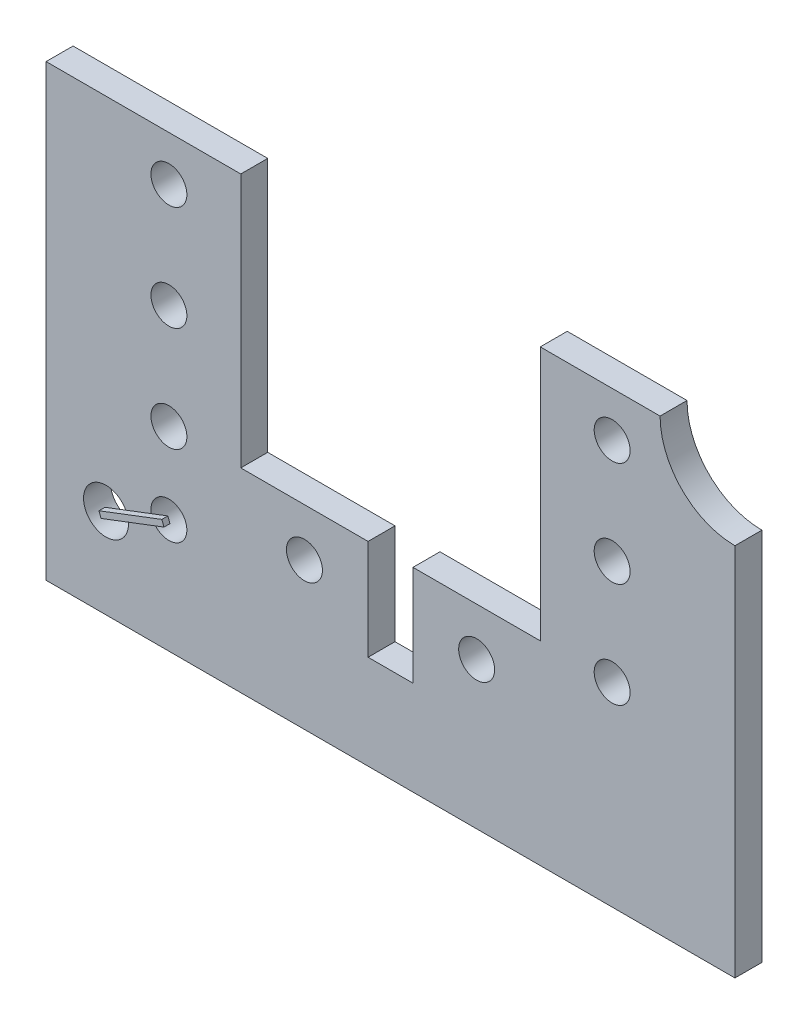
ISO-10303-21;
HEADER;
FILE_DESCRIPTION(('STEP AP214'),'2;1');
FILE_NAME('part.step','',(''),(''),'','','');
FILE_SCHEMA(('AUTOMOTIVE_DESIGN { 1 0 10303 214 1 1 1 1 }'));
ENDSEC;
DATA;
#1=APPLICATION_CONTEXT('core data for automotive mechanical design processes');
#2=APPLICATION_PROTOCOL_DEFINITION('international standard','automotive_design',2000,#1);
#3=PRODUCT_CONTEXT('',#1,'mechanical');
#4=PRODUCT('Part','Part','',(#3));
#5=PRODUCT_RELATED_PRODUCT_CATEGORY('part','',(#4));
#6=PRODUCT_DEFINITION_FORMATION('','',#4);
#7=PRODUCT_DEFINITION_CONTEXT('part definition',#1,'design');
#8=PRODUCT_DEFINITION('design','',#6,#7);
#9=PRODUCT_DEFINITION_SHAPE('','',#8);
#10=(LENGTH_UNIT() NAMED_UNIT(*) SI_UNIT(.MILLI.,.METRE.));
#11=(NAMED_UNIT(*) PLANE_ANGLE_UNIT() SI_UNIT($,.RADIAN.));
#12=(NAMED_UNIT(*) SI_UNIT($,.STERADIAN.) SOLID_ANGLE_UNIT());
#13=UNCERTAINTY_MEASURE_WITH_UNIT(LENGTH_MEASURE(1.E-05),#10,'distance_accuracy_value','');
#14=(GEOMETRIC_REPRESENTATION_CONTEXT(3) GLOBAL_UNCERTAINTY_ASSIGNED_CONTEXT((#13)) GLOBAL_UNIT_ASSIGNED_CONTEXT((#10,
#11,#12)) REPRESENTATION_CONTEXT('',''));
#15=CARTESIAN_POINT('',(0.,0.,0.));
#16=DIRECTION('',(0.,0.,1.));
#17=DIRECTION('',(1.,0.,0.));
#18=AXIS2_PLACEMENT_3D('',#15,#16,#17);
#19=CARTESIAN_POINT('',(11.5,-3.5,-0.45));
#20=DIRECTION('',(0.,0.,1.));
#21=DIRECTION('',(1.,0.,0.));
#22=AXIS2_PLACEMENT_3D('',#19,#20,#21);
#23=PLANE('',#22);
#24=DIRECTION('',(-1.,0.,0.));
#25=VECTOR('',#24,1.);
#26=CARTESIAN_POINT('',(-5.,-12.,-0.45));
#27=LINE('',#26,#25);
#28=CARTESIAN_POINT('',(-0.75,-12.,-0.45));
#29=VERTEX_POINT('',#28);
#30=CARTESIAN_POINT('',(-5.,-12.,-0.45));
#31=VERTEX_POINT('',#30);
#32=EDGE_CURVE('E373',#29,#31,#27,.T.);
#33=ORIENTED_EDGE('',*,*,#32,.F.);
#34=DIRECTION('',(0.,-1.,0.));
#35=VECTOR('',#34,1.);
#36=CARTESIAN_POINT('',(-0.750000000000001,-3.5,-0.45));
#37=LINE('',#36,#35);
#38=CARTESIAN_POINT('',(-0.75,-15.35,-0.45));
#39=VERTEX_POINT('',#38);
#40=EDGE_CURVE('E415',#29,#39,#37,.T.);
#41=ORIENTED_EDGE('',*,*,#40,.T.);
#42=DIRECTION('',(1.,0.,0.));
#43=VECTOR('',#42,1.);
#44=CARTESIAN_POINT('',(11.5,-15.35,-0.45));
#45=LINE('',#44,#43);
#46=CARTESIAN_POINT('',(0.750000000000001,-15.35,-0.45));
#47=VERTEX_POINT('',#46);
#48=EDGE_CURVE('E409',#39,#47,#45,.T.);
#49=ORIENTED_EDGE('',*,*,#48,.T.);
#50=DIRECTION('',(0.,1.,0.));
#51=VECTOR('',#50,1.);
#52=CARTESIAN_POINT('',(0.750000000000001,-3.5,-0.45));
#53=LINE('',#52,#51);
#54=CARTESIAN_POINT('',(0.75,-12.,-0.45));
#55=VERTEX_POINT('',#54);
#56=EDGE_CURVE('E412',#47,#55,#53,.T.);
#57=ORIENTED_EDGE('',*,*,#56,.T.);
#58=CARTESIAN_POINT('',(5.,-12.,-0.45));
#59=VERTEX_POINT('',#58);
#60=EDGE_CURVE('E374',#59,#55,#27,.T.);
#61=ORIENTED_EDGE('',*,*,#60,.F.);
#62=DIRECTION('',(0.,-1.,0.));
#63=VECTOR('',#62,1.);
#64=CARTESIAN_POINT('',(5.,-3.5,-0.45));
#65=LINE('',#64,#63);
#66=CARTESIAN_POINT('',(5.,-3.5,-0.45));
#67=VERTEX_POINT('',#66);
#68=EDGE_CURVE('E371',#67,#59,#65,.T.);
#69=ORIENTED_EDGE('',*,*,#68,.F.);
#70=DIRECTION('',(-1.,0.,0.));
#71=VECTOR('',#70,1.);
#72=CARTESIAN_POINT('',(5.,-3.5,-0.45));
#73=LINE('',#72,#71);
#74=CARTESIAN_POINT('',(9.,-3.5,-0.45));
#75=VERTEX_POINT('',#74);
#76=EDGE_CURVE('E369',#75,#67,#73,.T.);
#77=ORIENTED_EDGE('',*,*,#76,.F.);
#78=CARTESIAN_POINT('',(11.5,-3.5,-0.45));
#79=DIRECTION('',(0.,0.,-1.));
#80=DIRECTION('',(1.,0.,0.));
#81=AXIS2_PLACEMENT_3D('',#78,#79,#80);
#82=CIRCLE('',#81,2.5);
#83=CARTESIAN_POINT('',(11.5,-6.,-0.45));
#84=VERTEX_POINT('',#83);
#85=EDGE_CURVE('E367',#84,#75,#82,.T.);
#86=ORIENTED_EDGE('',*,*,#85,.F.);
#87=DIRECTION('',(0.,1.,0.));
#88=VECTOR('',#87,1.);
#89=CARTESIAN_POINT('',(11.5,-18.5,-0.45));
#90=LINE('',#89,#88);
#91=CARTESIAN_POINT('',(11.5,-18.5,-0.45));
#92=VERTEX_POINT('',#91);
#93=EDGE_CURVE('E365',#92,#84,#90,.T.);
#94=ORIENTED_EDGE('',*,*,#93,.F.);
#95=DIRECTION('',(1.,0.,0.));
#96=VECTOR('',#95,1.);
#97=CARTESIAN_POINT('',(-11.5,-18.5,-0.45));
#98=LINE('',#97,#96);
#99=CARTESIAN_POINT('',(-11.5,-18.5,-0.45));
#100=VERTEX_POINT('',#99);
#101=EDGE_CURVE('E340',#100,#92,#98,.T.);
#102=ORIENTED_EDGE('',*,*,#101,.F.);
#103=DIRECTION('',(0.,-1.,0.));
#104=VECTOR('',#103,1.);
#105=CARTESIAN_POINT('',(-11.5,-3.5,-0.45));
#106=LINE('',#105,#104);
#107=CARTESIAN_POINT('',(-11.5,-3.5,-0.45));
#108=VERTEX_POINT('',#107);
#109=EDGE_CURVE('E345',#108,#100,#106,.T.);
#110=ORIENTED_EDGE('',*,*,#109,.F.);
#111=DIRECTION('',(-1.,0.,0.));
#112=VECTOR('',#111,1.);
#113=CARTESIAN_POINT('',(-9.,-3.5,-0.45));
#114=LINE('',#113,#112);
#115=CARTESIAN_POINT('',(-5.,-3.5,-0.45));
#116=VERTEX_POINT('',#115);
#117=EDGE_CURVE('E380',#116,#108,#114,.T.);
#118=ORIENTED_EDGE('',*,*,#117,.F.);
#119=DIRECTION('',(0.,1.,0.));
#120=VECTOR('',#119,1.);
#121=CARTESIAN_POINT('',(-5.,-3.5,-0.45));
#122=LINE('',#121,#120);
#123=EDGE_CURVE('E377',#31,#116,#122,.T.);
#124=ORIENTED_EDGE('',*,*,#123,.F.);
#125=EDGE_LOOP('',(#33,#41,#49,#57,#61,#69,#77,#86,#94,#102,#110,#118,#124));
#126=FACE_BOUND('',#125,.T.);
#127=CARTESIAN_POINT('',(7.4,-8.5,-0.45));
#128=DIRECTION('',(0.,0.,1.));
#129=DIRECTION('',(1.,0.,0.));
#130=AXIS2_PLACEMENT_3D('',#127,#128,#129);
#131=CIRCLE('',#130,0.6);
#132=CARTESIAN_POINT('',(8.,-8.5,-0.45));
#133=VERTEX_POINT('',#132);
#134=EDGE_CURVE('E274',#133,#133,#131,.T.);
#135=ORIENTED_EDGE('',*,*,#134,.T.);
#136=EDGE_LOOP('',(#135));
#137=FACE_BOUND('',#136,.T.);
#138=CARTESIAN_POINT('',(-7.4,-5.,-0.45));
#139=DIRECTION('',(0.,0.,1.));
#140=DIRECTION('',(1.,0.,0.));
#141=AXIS2_PLACEMENT_3D('',#138,#139,#140);
#142=CIRCLE('',#141,0.6);
#143=CARTESIAN_POINT('',(-6.8,-5.,-0.45));
#144=VERTEX_POINT('',#143);
#145=EDGE_CURVE('E286',#144,#144,#142,.T.);
#146=ORIENTED_EDGE('',*,*,#145,.T.);
#147=EDGE_LOOP('',(#146));
#148=FACE_BOUND('',#147,.T.);
#149=CARTESIAN_POINT('',(7.4,-12.,-0.45));
#150=DIRECTION('',(0.,0.,1.));
#151=DIRECTION('',(1.,0.,0.));
#152=AXIS2_PLACEMENT_3D('',#149,#150,#151);
#153=CIRCLE('',#152,0.6);
#154=CARTESIAN_POINT('',(7.99999999999999,-12.,-0.45));
#155=VERTEX_POINT('',#154);
#156=EDGE_CURVE('E290',#155,#155,#153,.T.);
#157=ORIENTED_EDGE('',*,*,#156,.T.);
#158=EDGE_LOOP('',(#157));
#159=FACE_BOUND('',#158,.T.);
#160=CARTESIAN_POINT('',(2.875,-13.6,-0.45));
#161=DIRECTION('',(0.,0.,1.));
#162=DIRECTION('',(1.,0.,0.));
#163=AXIS2_PLACEMENT_3D('',#160,#161,#162);
#164=CIRCLE('',#163,0.6);
#165=CARTESIAN_POINT('',(3.475,-13.6,-0.45));
#166=VERTEX_POINT('',#165);
#167=EDGE_CURVE('E294',#166,#166,#164,.T.);
#168=ORIENTED_EDGE('',*,*,#167,.T.);
#169=EDGE_LOOP('',(#168));
#170=FACE_BOUND('',#169,.T.);
#171=CARTESIAN_POINT('',(-7.4,-8.5,-0.45));
#172=DIRECTION('',(0.,0.,1.));
#173=DIRECTION('',(1.,0.,0.));
#174=AXIS2_PLACEMENT_3D('',#171,#172,#173);
#175=CIRCLE('',#174,0.6);
#176=CARTESIAN_POINT('',(-6.8,-8.5,-0.45));
#177=VERTEX_POINT('',#176);
#178=EDGE_CURVE('E306',#177,#177,#175,.T.);
#179=ORIENTED_EDGE('',*,*,#178,.T.);
#180=EDGE_LOOP('',(#179));
#181=FACE_BOUND('',#180,.T.);
#182=CARTESIAN_POINT('',(-7.4,-12.,-0.45));
#183=DIRECTION('',(0.,0.,1.));
#184=DIRECTION('',(1.,0.,0.));
#185=AXIS2_PLACEMENT_3D('',#182,#183,#184);
#186=CIRCLE('',#185,0.6);
#187=CARTESIAN_POINT('',(-6.8,-12.,-0.45));
#188=VERTEX_POINT('',#187);
#189=EDGE_CURVE('E311',#188,#188,#186,.T.);
#190=ORIENTED_EDGE('',*,*,#189,.T.);
#191=EDGE_LOOP('',(#190));
#192=FACE_BOUND('',#191,.T.);
#193=CARTESIAN_POINT('',(7.4,-5.,-0.45));
#194=DIRECTION('',(0.,0.,1.));
#195=DIRECTION('',(1.,0.,0.));
#196=AXIS2_PLACEMENT_3D('',#193,#194,#195);
#197=CIRCLE('',#196,0.6);
#198=CARTESIAN_POINT('',(8.,-5.,-0.45));
#199=VERTEX_POINT('',#198);
#200=EDGE_CURVE('E315',#199,#199,#197,.T.);
#201=ORIENTED_EDGE('',*,*,#200,.T.);
#202=EDGE_LOOP('',(#201));
#203=FACE_BOUND('',#202,.T.);
#204=CARTESIAN_POINT('',(-9.5,-15.5,-0.45));
#205=DIRECTION('',(0.,0.,1.));
#206=DIRECTION('',(1.,0.,0.));
#207=AXIS2_PLACEMENT_3D('',#204,#205,#206);
#208=CIRCLE('',#207,0.75);
#209=CARTESIAN_POINT('',(-8.75,-15.5,-0.45));
#210=VERTEX_POINT('',#209);
#211=EDGE_CURVE('E40',#210,#210,#208,.T.);
#212=ORIENTED_EDGE('',*,*,#211,.T.);
#213=EDGE_LOOP('',(#212));
#214=FACE_BOUND('',#213,.T.);
#215=DIRECTION('',(-0.971700915312232,-0.236214587147725,0.));
#216=VECTOR('',#215,1.);
#217=CARTESIAN_POINT('',(-2.84783532247801,-13.7117456052609,-0.45));
#218=LINE('',#217,#216);
#219=CARTESIAN_POINT('',(-3.42004671740088,-13.8508467178388,-0.45));
#220=VERTEX_POINT('',#219);
#221=CARTESIAN_POINT('',(-6.80062392755513,-14.672644492683,-0.45));
#222=VERTEX_POINT('',#221);
#223=EDGE_CURVE('E11',#220,#222,#218,.T.);
#224=ORIENTED_EDGE('',*,*,#223,.F.);
#225=CARTESIAN_POINT('',(-2.875,-13.6,-0.45));
#226=DIRECTION('',(0.,0.,1.));
#227=DIRECTION('',(1.,0.,0.));
#228=AXIS2_PLACEMENT_3D('',#225,#226,#227);
#229=CIRCLE('',#228,0.6);
#230=CARTESIAN_POINT('',(-3.47437607244486,-13.627355507317,-0.45));
#231=VERTEX_POINT('',#230);
#232=EDGE_CURVE('E301',#220,#231,#229,.T.);
#233=ORIENTED_EDGE('',*,*,#232,.T.);
#234=DIRECTION('',(-0.971700915312232,-0.236214587147725,0.));
#235=VECTOR('',#234,1.);
#236=CARTESIAN_POINT('',(-2.90216467752199,-13.4882543947391,-0.45));
#237=LINE('',#236,#235);
#238=CARTESIAN_POINT('',(-6.85495328259911,-14.4491532821612,-0.45));
#239=VERTEX_POINT('',#238);
#240=EDGE_CURVE('E45',#231,#239,#237,.T.);
#241=ORIENTED_EDGE('',*,*,#240,.T.);
#242=CARTESIAN_POINT('',(-7.4,-14.7,-0.45));
#243=DIRECTION('',(0.,0.,1.));
#244=DIRECTION('',(1.,0.,0.));
#245=AXIS2_PLACEMENT_3D('',#242,#243,#244);
#246=CIRCLE('',#245,0.6);
#247=EDGE_CURVE('E298',#239,#222,#246,.T.);
#248=ORIENTED_EDGE('',*,*,#247,.T.);
#249=EDGE_LOOP('',(#224,#233,#241,#248));
#250=FACE_BOUND('',#249,.T.);
#251=ADVANCED_FACE('F36',(#126,#137,#148,#159,#170,#181,#192,#203,#214,#250),#23,.F.);
#252=CARTESIAN_POINT('',(11.5,-3.5,0.45));
#253=DIRECTION('',(0.,0.,1.));
#254=DIRECTION('',(1.,0.,0.));
#255=AXIS2_PLACEMENT_3D('',#252,#253,#254);
#256=PLANE('',#255);
#257=CARTESIAN_POINT('',(7.4,-5.,0.45));
#258=DIRECTION('',(0.,0.,1.));
#259=DIRECTION('',(1.,0.,0.));
#260=AXIS2_PLACEMENT_3D('',#257,#258,#259);
#261=CIRCLE('',#260,0.6);
#262=CARTESIAN_POINT('',(8.,-5.,0.45));
#263=VERTEX_POINT('',#262);
#264=EDGE_CURVE('E316',#263,#263,#261,.T.);
#265=ORIENTED_EDGE('',*,*,#264,.F.);
#266=EDGE_LOOP('',(#265));
#267=FACE_BOUND('',#266,.T.);
#268=CARTESIAN_POINT('',(-7.4,-12.,0.45));
#269=DIRECTION('',(0.,0.,1.));
#270=DIRECTION('',(1.,0.,0.));
#271=AXIS2_PLACEMENT_3D('',#268,#269,#270);
#272=CIRCLE('',#271,0.6);
#273=CARTESIAN_POINT('',(-6.8,-12.,0.45));
#274=VERTEX_POINT('',#273);
#275=EDGE_CURVE('E312',#274,#274,#272,.T.);
#276=ORIENTED_EDGE('',*,*,#275,.F.);
#277=EDGE_LOOP('',(#276));
#278=FACE_BOUND('',#277,.T.);
#279=CARTESIAN_POINT('',(-7.4,-8.5,0.45));
#280=DIRECTION('',(0.,0.,1.));
#281=DIRECTION('',(1.,0.,0.));
#282=AXIS2_PLACEMENT_3D('',#279,#280,#281);
#283=CIRCLE('',#282,0.6);
#284=CARTESIAN_POINT('',(-6.8,-8.5,0.45));
#285=VERTEX_POINT('',#284);
#286=EDGE_CURVE('E308',#285,#285,#283,.T.);
#287=ORIENTED_EDGE('',*,*,#286,.F.);
#288=EDGE_LOOP('',(#287));
#289=FACE_BOUND('',#288,.T.);
#290=CARTESIAN_POINT('',(-2.875,-13.6,0.45));
#291=DIRECTION('',(0.,0.,1.));
#292=DIRECTION('',(1.,0.,0.));
#293=AXIS2_PLACEMENT_3D('',#290,#291,#292);
#294=CIRCLE('',#293,0.6);
#295=CARTESIAN_POINT('',(-2.275,-13.6,0.45));
#296=VERTEX_POINT('',#295);
#297=EDGE_CURVE('E303',#296,#296,#294,.T.);
#298=ORIENTED_EDGE('',*,*,#297,.F.);
#299=EDGE_LOOP('',(#298));
#300=FACE_BOUND('',#299,.T.);
#301=CARTESIAN_POINT('',(2.875,-13.6,0.45));
#302=DIRECTION('',(0.,0.,1.));
#303=DIRECTION('',(1.,0.,0.));
#304=AXIS2_PLACEMENT_3D('',#301,#302,#303);
#305=CIRCLE('',#304,0.6);
#306=CARTESIAN_POINT('',(3.475,-13.6,0.45));
#307=VERTEX_POINT('',#306);
#308=EDGE_CURVE('E295',#307,#307,#305,.T.);
#309=ORIENTED_EDGE('',*,*,#308,.F.);
#310=EDGE_LOOP('',(#309));
#311=FACE_BOUND('',#310,.T.);
#312=CARTESIAN_POINT('',(7.4,-12.,0.45));
#313=DIRECTION('',(0.,0.,1.));
#314=DIRECTION('',(1.,0.,0.));
#315=AXIS2_PLACEMENT_3D('',#312,#313,#314);
#316=CIRCLE('',#315,0.6);
#317=CARTESIAN_POINT('',(7.99999999999999,-12.,0.45));
#318=VERTEX_POINT('',#317);
#319=EDGE_CURVE('E291',#318,#318,#316,.T.);
#320=ORIENTED_EDGE('',*,*,#319,.F.);
#321=EDGE_LOOP('',(#320));
#322=FACE_BOUND('',#321,.T.);
#323=CARTESIAN_POINT('',(-7.4,-5.,0.45));
#324=DIRECTION('',(0.,0.,1.));
#325=DIRECTION('',(1.,0.,0.));
#326=AXIS2_PLACEMENT_3D('',#323,#324,#325);
#327=CIRCLE('',#326,0.6);
#328=CARTESIAN_POINT('',(-6.8,-5.,0.45));
#329=VERTEX_POINT('',#328);
#330=EDGE_CURVE('E287',#329,#329,#327,.T.);
#331=ORIENTED_EDGE('',*,*,#330,.F.);
#332=EDGE_LOOP('',(#331));
#333=FACE_BOUND('',#332,.T.);
#334=CARTESIAN_POINT('',(7.4,-8.5,0.45));
#335=DIRECTION('',(0.,0.,1.));
#336=DIRECTION('',(1.,0.,0.));
#337=AXIS2_PLACEMENT_3D('',#334,#335,#336);
#338=CIRCLE('',#337,0.6);
#339=CARTESIAN_POINT('',(8.,-8.5,0.45));
#340=VERTEX_POINT('',#339);
#341=EDGE_CURVE('E283',#340,#340,#338,.T.);
#342=ORIENTED_EDGE('',*,*,#341,.F.);
#343=EDGE_LOOP('',(#342));
#344=FACE_BOUND('',#343,.T.);
#345=DIRECTION('',(0.,-1.,0.));
#346=VECTOR('',#345,1.);
#347=CARTESIAN_POINT('',(-0.750000000000001,-3.5,0.45));
#348=LINE('',#347,#346);
#349=CARTESIAN_POINT('',(-0.75,-12.,0.45));
#350=VERTEX_POINT('',#349);
#351=CARTESIAN_POINT('',(-0.75,-15.35,0.45));
#352=VERTEX_POINT('',#351);
#353=EDGE_CURVE('E338',#350,#352,#348,.T.);
#354=ORIENTED_EDGE('',*,*,#353,.F.);
#355=DIRECTION('',(-1.,0.,0.));
#356=VECTOR('',#355,1.);
#357=CARTESIAN_POINT('',(-5.,-12.,0.45));
#358=LINE('',#357,#356);
#359=CARTESIAN_POINT('',(-5.,-12.,0.45));
#360=VERTEX_POINT('',#359);
#361=EDGE_CURVE('E355',#350,#360,#358,.T.);
#362=ORIENTED_EDGE('',*,*,#361,.T.);
#363=DIRECTION('',(0.,1.,0.));
#364=VECTOR('',#363,1.);
#365=CARTESIAN_POINT('',(-5.,-3.5,0.45));
#366=LINE('',#365,#364);
#367=CARTESIAN_POINT('',(-5.,-3.5,0.45));
#368=VERTEX_POINT('',#367);
#369=EDGE_CURVE('E359',#360,#368,#366,.T.);
#370=ORIENTED_EDGE('',*,*,#369,.T.);
#371=DIRECTION('',(-1.,0.,0.));
#372=VECTOR('',#371,1.);
#373=CARTESIAN_POINT('',(-5.,-3.5,0.45));
#374=LINE('',#373,#372);
#375=CARTESIAN_POINT('',(-11.5,-3.5,0.45));
#376=VERTEX_POINT('',#375);
#377=EDGE_CURVE('E361',#368,#376,#374,.T.);
#378=ORIENTED_EDGE('',*,*,#377,.T.);
#379=DIRECTION('',(0.,-1.,0.));
#380=VECTOR('',#379,1.);
#381=CARTESIAN_POINT('',(-11.5,-18.5,0.45));
#382=LINE('',#381,#380);
#383=CARTESIAN_POINT('',(-11.5,-18.5,0.45));
#384=VERTEX_POINT('',#383);
#385=EDGE_CURVE('E341',#376,#384,#382,.T.);
#386=ORIENTED_EDGE('',*,*,#385,.T.);
#387=DIRECTION('',(1.,0.,0.));
#388=VECTOR('',#387,1.);
#389=CARTESIAN_POINT('',(-11.5,-18.5,0.45));
#390=LINE('',#389,#388);
#391=CARTESIAN_POINT('',(11.5,-18.5,0.45));
#392=VERTEX_POINT('',#391);
#393=EDGE_CURVE('E344',#384,#392,#390,.T.);
#394=ORIENTED_EDGE('',*,*,#393,.T.);
#395=DIRECTION('',(0.,1.,0.));
#396=VECTOR('',#395,1.);
#397=CARTESIAN_POINT('',(11.5,-18.5,0.45));
#398=LINE('',#397,#396);
#399=CARTESIAN_POINT('',(11.5,-6.,0.45));
#400=VERTEX_POINT('',#399);
#401=EDGE_CURVE('E347',#392,#400,#398,.T.);
#402=ORIENTED_EDGE('',*,*,#401,.T.);
#403=CARTESIAN_POINT('',(11.5,-3.5,0.45));
#404=DIRECTION('',(0.,0.,-1.));
#405=DIRECTION('',(1.,0.,0.));
#406=AXIS2_PLACEMENT_3D('',#403,#404,#405);
#407=CIRCLE('',#406,2.5);
#408=CARTESIAN_POINT('',(9.,-3.5,0.45));
#409=VERTEX_POINT('',#408);
#410=EDGE_CURVE('E349',#400,#409,#407,.T.);
#411=ORIENTED_EDGE('',*,*,#410,.T.);
#412=DIRECTION('',(-1.,0.,0.));
#413=VECTOR('',#412,1.);
#414=CARTESIAN_POINT('',(5.,-3.5,0.45));
#415=LINE('',#414,#413);
#416=CARTESIAN_POINT('',(5.,-3.5,0.45));
#417=VERTEX_POINT('',#416);
#418=EDGE_CURVE('E351',#409,#417,#415,.T.);
#419=ORIENTED_EDGE('',*,*,#418,.T.);
#420=DIRECTION('',(0.,-1.,0.));
#421=VECTOR('',#420,1.);
#422=CARTESIAN_POINT('',(5.,-3.5,0.45));
#423=LINE('',#422,#421);
#424=CARTESIAN_POINT('',(5.,-12.,0.45));
#425=VERTEX_POINT('',#424);
#426=EDGE_CURVE('E353',#417,#425,#423,.T.);
#427=ORIENTED_EDGE('',*,*,#426,.T.);
#428=CARTESIAN_POINT('',(0.75,-12.,0.45));
#429=VERTEX_POINT('',#428);
#430=EDGE_CURVE('E356',#425,#429,#358,.T.);
#431=ORIENTED_EDGE('',*,*,#430,.T.);
#432=DIRECTION('',(0.,1.,0.));
#433=VECTOR('',#432,1.);
#434=CARTESIAN_POINT('',(0.750000000000001,-3.5,0.45));
#435=LINE('',#434,#433);
#436=CARTESIAN_POINT('',(0.75,-15.35,0.45));
#437=VERTEX_POINT('',#436);
#438=EDGE_CURVE('E336',#437,#429,#435,.T.);
#439=ORIENTED_EDGE('',*,*,#438,.F.);
#440=DIRECTION('',(1.,0.,0.));
#441=VECTOR('',#440,1.);
#442=CARTESIAN_POINT('',(11.5,-15.35,0.45));
#443=LINE('',#442,#441);
#444=EDGE_CURVE('E326',#352,#437,#443,.T.);
#445=ORIENTED_EDGE('',*,*,#444,.F.);
#446=EDGE_LOOP('',(#354,#362,#370,#378,#386,#394,#402,#411,#419,#427,#431,#439,#445));
#447=FACE_BOUND('',#446,.T.);
#448=CARTESIAN_POINT('',(-9.5,-15.5,0.45));
#449=DIRECTION('',(0.,0.,1.));
#450=DIRECTION('',(1.,0.,0.));
#451=AXIS2_PLACEMENT_3D('',#448,#449,#450);
#452=CIRCLE('',#451,0.75);
#453=CARTESIAN_POINT('',(-8.8409915872102,-15.1419386758218,0.45));
#454=VERTEX_POINT('',#453);
#455=CARTESIAN_POINT('',(-8.7697925216918,-15.3288362228076,0.45));
#456=VERTEX_POINT('',#455);
#457=EDGE_CURVE('E323',#454,#456,#452,.T.);
#458=ORIENTED_EDGE('',*,*,#457,.F.);
#459=DIRECTION('',(0.934487734928968,0.355995327591989,0.));
#460=VECTOR('',#459,1.);
#461=CARTESIAN_POINT('',(-9.5355995327592,-15.4065512265071,0.45));
#462=LINE('',#461,#460);
#463=CARTESIAN_POINT('',(-7.98844993237598,-14.8171609025516,0.45));
#464=VERTEX_POINT('',#463);
#465=EDGE_CURVE('E63',#454,#464,#462,.T.);
#466=ORIENTED_EDGE('',*,*,#465,.T.);
#467=CARTESIAN_POINT('',(-7.4,-14.7,0.45));
#468=DIRECTION('',(0.,0.,1.));
#469=DIRECTION('',(1.,0.,0.));
#470=AXIS2_PLACEMENT_3D('',#467,#468,#469);
#471=CIRCLE('',#470,0.6);
#472=CARTESIAN_POINT('',(-7.91725086685758,-15.0040584495374,0.45));
#473=VERTEX_POINT('',#472);
#474=EDGE_CURVE('E302',#473,#464,#471,.T.);
#475=ORIENTED_EDGE('',*,*,#474,.F.);
#476=DIRECTION('',(0.934487734928968,0.355995327591989,0.));
#477=VECTOR('',#476,1.);
#478=CARTESIAN_POINT('',(-9.4644004672408,-15.5934487734929,0.45));
#479=LINE('',#478,#477);
#480=EDGE_CURVE('E270',#456,#473,#479,.T.);
#481=ORIENTED_EDGE('',*,*,#480,.F.);
#482=EDGE_LOOP('',(#458,#466,#475,#481));
#483=FACE_BOUND('',#482,.T.);
#484=ADVANCED_FACE('F455',(#267,#278,#289,#300,#311,#322,#333,#344,#447,#483),#256,.T.);
#485=CARTESIAN_POINT('',(-5.,-12.,0.45));
#486=DIRECTION('',(0.,-1.,0.));
#487=DIRECTION('',(0.,0.,-1.));
#488=AXIS2_PLACEMENT_3D('',#485,#486,#487);
#489=PLANE('',#488);
#490=ORIENTED_EDGE('',*,*,#361,.F.);
#491=DIRECTION('',(0.,0.,1.));
#492=VECTOR('',#491,1.);
#493=CARTESIAN_POINT('',(-0.75,-12.,-5.));
#494=LINE('',#493,#492);
#495=EDGE_CURVE('E324',#29,#350,#494,.T.);
#496=ORIENTED_EDGE('',*,*,#495,.F.);
#497=ORIENTED_EDGE('',*,*,#32,.T.);
#498=DIRECTION('',(0.,0.,-1.));
#499=VECTOR('',#498,1.);
#500=CARTESIAN_POINT('',(-5.,-12.,0.45));
#501=LINE('',#500,#499);
#502=EDGE_CURVE('E388',#360,#31,#501,.T.);
#503=ORIENTED_EDGE('',*,*,#502,.F.);
#504=EDGE_LOOP('',(#490,#496,#497,#503));
#505=FACE_BOUND('',#504,.T.);
#506=ADVANCED_FACE('F461',(#505),#489,.F.);
#507=CARTESIAN_POINT('',(-11.5,-18.5,0.45));
#508=DIRECTION('',(0.,1.,0.));
#509=DIRECTION('',(0.,0.,1.));
#510=AXIS2_PLACEMENT_3D('',#507,#508,#509);
#511=PLANE('',#510);
#512=ORIENTED_EDGE('',*,*,#101,.T.);
#513=DIRECTION('',(0.,0.,-1.));
#514=VECTOR('',#513,1.);
#515=CARTESIAN_POINT('',(11.5,-18.5,0.45));
#516=LINE('',#515,#514);
#517=EDGE_CURVE('E403',#392,#92,#516,.T.);
#518=ORIENTED_EDGE('',*,*,#517,.F.);
#519=ORIENTED_EDGE('',*,*,#393,.F.);
#520=DIRECTION('',(0.,0.,-1.));
#521=VECTOR('',#520,1.);
#522=CARTESIAN_POINT('',(-11.5,-18.5,0.45));
#523=LINE('',#522,#521);
#524=EDGE_CURVE('E406',#384,#100,#523,.T.);
#525=ORIENTED_EDGE('',*,*,#524,.T.);
#526=EDGE_LOOP('',(#512,#518,#519,#525));
#527=FACE_BOUND('',#526,.T.);
#528=ADVANCED_FACE('F38',(#527),#511,.F.);
#529=CARTESIAN_POINT('',(11.5,-18.5,0.45));
#530=DIRECTION('',(-1.,0.,0.));
#531=DIRECTION('',(0.,0.,1.));
#532=AXIS2_PLACEMENT_3D('',#529,#530,#531);
#533=PLANE('',#532);
#534=ORIENTED_EDGE('',*,*,#93,.T.);
#535=DIRECTION('',(0.,0.,-1.));
#536=VECTOR('',#535,1.);
#537=CARTESIAN_POINT('',(11.5,-6.,0.45));
#538=LINE('',#537,#536);
#539=EDGE_CURVE('E400',#400,#84,#538,.T.);
#540=ORIENTED_EDGE('',*,*,#539,.F.);
#541=ORIENTED_EDGE('',*,*,#401,.F.);
#542=ORIENTED_EDGE('',*,*,#517,.T.);
#543=EDGE_LOOP('',(#534,#540,#541,#542));
#544=FACE_BOUND('',#543,.T.);
#545=ADVANCED_FACE('F495',(#544),#533,.F.);
#546=CARTESIAN_POINT('',(11.5,-3.5,0.45));
#547=DIRECTION('',(0.,0.,-1.));
#548=DIRECTION('',(-1.,0.,0.));
#549=AXIS2_PLACEMENT_3D('',#546,#547,#548);
#550=CYLINDRICAL_SURFACE('',#549,2.5);
#551=ORIENTED_EDGE('',*,*,#85,.T.);
#552=DIRECTION('',(0.,0.,-1.));
#553=VECTOR('',#552,1.);
#554=CARTESIAN_POINT('',(9.,-3.5,0.45));
#555=LINE('',#554,#553);
#556=EDGE_CURVE('E397',#409,#75,#555,.T.);
#557=ORIENTED_EDGE('',*,*,#556,.F.);
#558=ORIENTED_EDGE('',*,*,#410,.F.);
#559=ORIENTED_EDGE('',*,*,#539,.T.);
#560=EDGE_LOOP('',(#551,#557,#558,#559));
#561=FACE_BOUND('',#560,.T.);
#562=ADVANCED_FACE('F492',(#561),#550,.F.);
#563=CARTESIAN_POINT('',(5.,-3.5,0.45));
#564=DIRECTION('',(0.,-1.,0.));
#565=DIRECTION('',(0.,0.,-1.));
#566=AXIS2_PLACEMENT_3D('',#563,#564,#565);
#567=PLANE('',#566);
#568=ORIENTED_EDGE('',*,*,#76,.T.);
#569=DIRECTION('',(0.,0.,-1.));
#570=VECTOR('',#569,1.);
#571=CARTESIAN_POINT('',(5.,-3.5,0.45));
#572=LINE('',#571,#570);
#573=EDGE_CURVE('E394',#417,#67,#572,.T.);
#574=ORIENTED_EDGE('',*,*,#573,.F.);
#575=ORIENTED_EDGE('',*,*,#418,.F.);
#576=ORIENTED_EDGE('',*,*,#556,.T.);
#577=EDGE_LOOP('',(#568,#574,#575,#576));
#578=FACE_BOUND('',#577,.T.);
#579=ADVANCED_FACE('F488',(#578),#567,.F.);
#580=CARTESIAN_POINT('',(5.,-3.5,0.45));
#581=DIRECTION('',(1.,0.,0.));
#582=DIRECTION('',(0.,1.,0.));
#583=AXIS2_PLACEMENT_3D('',#580,#581,#582);
#584=PLANE('',#583);
#585=ORIENTED_EDGE('',*,*,#68,.T.);
#586=DIRECTION('',(0.,0.,-1.));
#587=VECTOR('',#586,1.);
#588=CARTESIAN_POINT('',(5.,-12.,0.45));
#589=LINE('',#588,#587);
#590=EDGE_CURVE('E391',#425,#59,#589,.T.);
#591=ORIENTED_EDGE('',*,*,#590,.F.);
#592=ORIENTED_EDGE('',*,*,#426,.F.);
#593=ORIENTED_EDGE('',*,*,#573,.T.);
#594=EDGE_LOOP('',(#585,#591,#592,#593));
#595=FACE_BOUND('',#594,.T.);
#596=ADVANCED_FACE('F484',(#595),#584,.F.);
#597=ORIENTED_EDGE('',*,*,#60,.T.);
#598=DIRECTION('',(0.,0.,1.));
#599=VECTOR('',#598,1.);
#600=CARTESIAN_POINT('',(0.75,-12.,-5.));
#601=LINE('',#600,#599);
#602=EDGE_CURVE('E327',#55,#429,#601,.T.);
#603=ORIENTED_EDGE('',*,*,#602,.T.);
#604=ORIENTED_EDGE('',*,*,#430,.F.);
#605=ORIENTED_EDGE('',*,*,#590,.T.);
#606=EDGE_LOOP('',(#597,#603,#604,#605));
#607=FACE_BOUND('',#606,.T.);
#608=ADVANCED_FACE('F480',(#607),#489,.F.);
#609=CARTESIAN_POINT('',(-5.,-3.5,0.45));
#610=DIRECTION('',(-1.,0.,0.));
#611=DIRECTION('',(0.,-1.,0.));
#612=AXIS2_PLACEMENT_3D('',#609,#610,#611);
#613=PLANE('',#612);
#614=ORIENTED_EDGE('',*,*,#123,.T.);
#615=DIRECTION('',(0.,0.,-1.));
#616=VECTOR('',#615,1.);
#617=CARTESIAN_POINT('',(-5.,-3.5,0.45));
#618=LINE('',#617,#616);
#619=EDGE_CURVE('E385',#368,#116,#618,.T.);
#620=ORIENTED_EDGE('',*,*,#619,.F.);
#621=ORIENTED_EDGE('',*,*,#369,.F.);
#622=ORIENTED_EDGE('',*,*,#502,.T.);
#623=EDGE_LOOP('',(#614,#620,#621,#622));
#624=FACE_BOUND('',#623,.T.);
#625=ADVANCED_FACE('F476',(#624),#613,.F.);
#626=CARTESIAN_POINT('',(-9.,-3.5,0.45));
#627=DIRECTION('',(0.,-1.,0.));
#628=DIRECTION('',(0.,0.,-1.));
#629=AXIS2_PLACEMENT_3D('',#626,#627,#628);
#630=PLANE('',#629);
#631=ORIENTED_EDGE('',*,*,#117,.T.);
#632=DIRECTION('',(0.,0.,-1.));
#633=VECTOR('',#632,1.);
#634=CARTESIAN_POINT('',(-11.5,-3.5,0.45));
#635=LINE('',#634,#633);
#636=EDGE_CURVE('E363',#376,#108,#635,.T.);
#637=ORIENTED_EDGE('',*,*,#636,.F.);
#638=ORIENTED_EDGE('',*,*,#377,.F.);
#639=ORIENTED_EDGE('',*,*,#619,.T.);
#640=EDGE_LOOP('',(#631,#637,#638,#639));
#641=FACE_BOUND('',#640,.T.);
#642=ADVANCED_FACE('F472',(#641),#630,.F.);
#643=CARTESIAN_POINT('',(-11.5,-3.5,0.45));
#644=DIRECTION('',(1.,0.,0.));
#645=DIRECTION('',(0.,0.,-1.));
#646=AXIS2_PLACEMENT_3D('',#643,#644,#645);
#647=PLANE('',#646);
#648=ORIENTED_EDGE('',*,*,#109,.T.);
#649=ORIENTED_EDGE('',*,*,#524,.F.);
#650=ORIENTED_EDGE('',*,*,#385,.F.);
#651=ORIENTED_EDGE('',*,*,#636,.T.);
#652=EDGE_LOOP('',(#648,#649,#650,#651));
#653=FACE_BOUND('',#652,.T.);
#654=ADVANCED_FACE('F468',(#653),#647,.F.);
#655=CARTESIAN_POINT('',(-0.75,-15.25,-5.));
#656=DIRECTION('',(-1.,0.,0.));
#657=DIRECTION('',(0.,-1.,0.));
#658=AXIS2_PLACEMENT_3D('',#655,#656,#657);
#659=PLANE('',#658);
#660=ORIENTED_EDGE('',*,*,#353,.T.);
#661=DIRECTION('',(0.,0.,1.));
#662=VECTOR('',#661,1.);
#663=CARTESIAN_POINT('',(-0.75,-15.35,-5.));
#664=LINE('',#663,#662);
#665=EDGE_CURVE('E322',#39,#352,#664,.T.);
#666=ORIENTED_EDGE('',*,*,#665,.F.);
#667=ORIENTED_EDGE('',*,*,#40,.F.);
#668=ORIENTED_EDGE('',*,*,#495,.T.);
#669=EDGE_LOOP('',(#660,#666,#667,#668));
#670=FACE_BOUND('',#669,.T.);
#671=ADVANCED_FACE('F471',(#670),#659,.F.);
#672=CARTESIAN_POINT('',(0.75,-15.25,-5.));
#673=DIRECTION('',(1.,0.,0.));
#674=DIRECTION('',(0.,1.,0.));
#675=AXIS2_PLACEMENT_3D('',#672,#673,#674);
#676=PLANE('',#675);
#677=ORIENTED_EDGE('',*,*,#438,.T.);
#678=ORIENTED_EDGE('',*,*,#602,.F.);
#679=ORIENTED_EDGE('',*,*,#56,.F.);
#680=DIRECTION('',(0.,0.,1.));
#681=VECTOR('',#680,1.);
#682=CARTESIAN_POINT('',(0.75,-15.35,-5.));
#683=LINE('',#682,#681);
#684=EDGE_CURVE('E330',#47,#437,#683,.T.);
#685=ORIENTED_EDGE('',*,*,#684,.T.);
#686=EDGE_LOOP('',(#677,#678,#679,#685));
#687=FACE_BOUND('',#686,.T.);
#688=ADVANCED_FACE('F541',(#687),#676,.F.);
#689=CARTESIAN_POINT('',(-0.75,-15.35,-5.));
#690=DIRECTION('',(0.,-1.,0.));
#691=DIRECTION('',(0.,0.,-1.));
#692=AXIS2_PLACEMENT_3D('',#689,#690,#691);
#693=PLANE('',#692);
#694=ORIENTED_EDGE('',*,*,#444,.T.);
#695=ORIENTED_EDGE('',*,*,#684,.F.);
#696=ORIENTED_EDGE('',*,*,#48,.F.);
#697=ORIENTED_EDGE('',*,*,#665,.T.);
#698=EDGE_LOOP('',(#694,#695,#696,#697));
#699=FACE_BOUND('',#698,.T.);
#700=ADVANCED_FACE('F538',(#699),#693,.F.);
#701=CARTESIAN_POINT('',(7.4,-8.5,-5.));
#702=DIRECTION('',(0.,0.,1.));
#703=DIRECTION('',(1.,0.,0.));
#704=AXIS2_PLACEMENT_3D('',#701,#702,#703);
#705=CYLINDRICAL_SURFACE('',#704,0.6);
#706=ORIENTED_EDGE('',*,*,#341,.T.);
#707=EDGE_LOOP('',(#706));
#708=FACE_BOUND('',#707,.T.);
#709=ORIENTED_EDGE('',*,*,#134,.F.);
#710=EDGE_LOOP('',(#709));
#711=FACE_BOUND('',#710,.T.);
#712=ADVANCED_FACE('F548',(#708,#711),#705,.F.);
#713=CARTESIAN_POINT('',(-7.4,-5.,-5.));
#714=DIRECTION('',(0.,0.,1.));
#715=DIRECTION('',(1.,0.,0.));
#716=AXIS2_PLACEMENT_3D('',#713,#714,#715);
#717=CYLINDRICAL_SURFACE('',#716,0.6);
#718=ORIENTED_EDGE('',*,*,#330,.T.);
#719=EDGE_LOOP('',(#718));
#720=FACE_BOUND('',#719,.T.);
#721=ORIENTED_EDGE('',*,*,#145,.F.);
#722=EDGE_LOOP('',(#721));
#723=FACE_BOUND('',#722,.T.);
#724=ADVANCED_FACE('F565',(#720,#723),#717,.F.);
#725=CARTESIAN_POINT('',(7.4,-12.,-5.));
#726=DIRECTION('',(0.,0.,1.));
#727=DIRECTION('',(1.,0.,0.));
#728=AXIS2_PLACEMENT_3D('',#725,#726,#727);
#729=CYLINDRICAL_SURFACE('',#728,0.6);
#730=ORIENTED_EDGE('',*,*,#319,.T.);
#731=EDGE_LOOP('',(#730));
#732=FACE_BOUND('',#731,.T.);
#733=ORIENTED_EDGE('',*,*,#156,.F.);
#734=EDGE_LOOP('',(#733));
#735=FACE_BOUND('',#734,.T.);
#736=ADVANCED_FACE('F569',(#732,#735),#729,.F.);
#737=CARTESIAN_POINT('',(2.875,-13.6,-5.));
#738=DIRECTION('',(0.,0.,1.));
#739=DIRECTION('',(1.,0.,0.));
#740=AXIS2_PLACEMENT_3D('',#737,#738,#739);
#741=CYLINDRICAL_SURFACE('',#740,0.6);
#742=ORIENTED_EDGE('',*,*,#308,.T.);
#743=EDGE_LOOP('',(#742));
#744=FACE_BOUND('',#743,.T.);
#745=ORIENTED_EDGE('',*,*,#167,.F.);
#746=EDGE_LOOP('',(#745));
#747=FACE_BOUND('',#746,.T.);
#748=ADVANCED_FACE('F555',(#744,#747),#741,.F.);
#749=CARTESIAN_POINT('',(-7.4,-14.7,-5.));
#750=DIRECTION('',(0.,0.,1.));
#751=DIRECTION('',(1.,0.,0.));
#752=AXIS2_PLACEMENT_3D('',#749,#750,#751);
#753=CYLINDRICAL_SURFACE('',#752,0.6);
#754=EDGE_CURVE('E299',#464,#473,#471,.T.);
#755=ORIENTED_EDGE('',*,*,#754,.T.);
#756=ORIENTED_EDGE('',*,*,#474,.T.);
#757=EDGE_LOOP('',(#755,#756));
#758=FACE_BOUND('',#757,.T.);
#759=EDGE_CURVE('E426',#222,#239,#246,.T.);
#760=ORIENTED_EDGE('',*,*,#759,.F.);
#761=ORIENTED_EDGE('',*,*,#247,.F.);
#762=EDGE_LOOP('',(#760,#761));
#763=FACE_BOUND('',#762,.T.);
#764=ADVANCED_FACE('F551',(#758,#763),#753,.F.);
#765=CARTESIAN_POINT('',(-2.875,-13.6,-5.));
#766=DIRECTION('',(0.,0.,1.));
#767=DIRECTION('',(1.,0.,0.));
#768=AXIS2_PLACEMENT_3D('',#765,#766,#767);
#769=CYLINDRICAL_SURFACE('',#768,0.6);
#770=ORIENTED_EDGE('',*,*,#297,.T.);
#771=EDGE_LOOP('',(#770));
#772=FACE_BOUND('',#771,.T.);
#773=EDGE_CURVE('E307',#231,#220,#229,.T.);
#774=ORIENTED_EDGE('',*,*,#773,.F.);
#775=ORIENTED_EDGE('',*,*,#232,.F.);
#776=EDGE_LOOP('',(#774,#775));
#777=FACE_BOUND('',#776,.T.);
#778=ADVANCED_FACE('F554',(#772,#777),#769,.F.);
#779=CARTESIAN_POINT('',(-7.4,-8.5,-5.));
#780=DIRECTION('',(0.,0.,1.));
#781=DIRECTION('',(1.,0.,0.));
#782=AXIS2_PLACEMENT_3D('',#779,#780,#781);
#783=CYLINDRICAL_SURFACE('',#782,0.6);
#784=ORIENTED_EDGE('',*,*,#286,.T.);
#785=EDGE_LOOP('',(#784));
#786=FACE_BOUND('',#785,.T.);
#787=ORIENTED_EDGE('',*,*,#178,.F.);
#788=EDGE_LOOP('',(#787));
#789=FACE_BOUND('',#788,.T.);
#790=ADVANCED_FACE('F450',(#786,#789),#783,.F.);
#791=CARTESIAN_POINT('',(-7.4,-12.,-5.));
#792=DIRECTION('',(0.,0.,1.));
#793=DIRECTION('',(1.,0.,0.));
#794=AXIS2_PLACEMENT_3D('',#791,#792,#793);
#795=CYLINDRICAL_SURFACE('',#794,0.6);
#796=ORIENTED_EDGE('',*,*,#275,.T.);
#797=EDGE_LOOP('',(#796));
#798=FACE_BOUND('',#797,.T.);
#799=ORIENTED_EDGE('',*,*,#189,.F.);
#800=EDGE_LOOP('',(#799));
#801=FACE_BOUND('',#800,.T.);
#802=ADVANCED_FACE('F440',(#798,#801),#795,.F.);
#803=CARTESIAN_POINT('',(7.4,-5.,-5.));
#804=DIRECTION('',(0.,0.,1.));
#805=DIRECTION('',(1.,0.,0.));
#806=AXIS2_PLACEMENT_3D('',#803,#804,#805);
#807=CYLINDRICAL_SURFACE('',#806,0.6);
#808=ORIENTED_EDGE('',*,*,#264,.T.);
#809=EDGE_LOOP('',(#808));
#810=FACE_BOUND('',#809,.T.);
#811=ORIENTED_EDGE('',*,*,#200,.F.);
#812=EDGE_LOOP('',(#811));
#813=FACE_BOUND('',#812,.T.);
#814=ADVANCED_FACE('F437',(#810,#813),#807,.F.);
#815=CARTESIAN_POINT('',(-9.5,-15.5,-5.));
#816=DIRECTION('',(0.,0.,1.));
#817=DIRECTION('',(1.,0.,0.));
#818=AXIS2_PLACEMENT_3D('',#815,#816,#817);
#819=CYLINDRICAL_SURFACE('',#818,0.75);
#820=EDGE_CURVE('E319',#456,#454,#452,.T.);
#821=ORIENTED_EDGE('',*,*,#820,.T.);
#822=ORIENTED_EDGE('',*,*,#457,.T.);
#823=EDGE_LOOP('',(#821,#822));
#824=FACE_BOUND('',#823,.T.);
#825=ORIENTED_EDGE('',*,*,#211,.F.);
#826=EDGE_LOOP('',(#825));
#827=FACE_BOUND('',#826,.T.);
#828=ADVANCED_FACE('F439',(#824,#827),#819,.F.);
#829=CARTESIAN_POINT('',(0.,0.,0.45));
#830=DIRECTION('',(0.,0.,1.));
#831=DIRECTION('',(1.,0.,0.));
#832=AXIS2_PLACEMENT_3D('',#829,#830,#831);
#833=PLANE('',#832);
#834=ORIENTED_EDGE('',*,*,#820,.F.);
#835=CARTESIAN_POINT('',(-9.4644004672408,-15.5934487734929,0.45));
#836=VERTEX_POINT('',#835);
#837=EDGE_CURVE('E267',#836,#456,#479,.T.);
#838=ORIENTED_EDGE('',*,*,#837,.F.);
#839=DIRECTION('',(0.355995327591983,-0.93448773492897,0.));
#840=VECTOR('',#839,1.);
#841=CARTESIAN_POINT('',(-9.5355995327592,-15.4065512265071,0.45));
#842=LINE('',#841,#840);
#843=CARTESIAN_POINT('',(-9.5355995327592,-15.4065512265071,0.45));
#844=VERTEX_POINT('',#843);
#845=EDGE_CURVE('E253',#844,#836,#842,.T.);
#846=ORIENTED_EDGE('',*,*,#845,.F.);
#847=EDGE_CURVE('E260',#844,#454,#462,.T.);
#848=ORIENTED_EDGE('',*,*,#847,.T.);
#849=EDGE_LOOP('',(#834,#838,#846,#848));
#850=FACE_BOUND('',#849,.T.);
#851=ADVANCED_FACE('F447',(#850),#833,.F.);
#852=CARTESIAN_POINT('',(-9.5355995327592,-15.4065512265071,0.65));
#853=DIRECTION('',(-0.355995327591989,0.934487734928968,0.));
#854=DIRECTION('',(-0.934487734928968,-0.355995327591989,0.));
#855=AXIS2_PLACEMENT_3D('',#852,#853,#854);
#856=PLANE('',#855);
#857=ORIENTED_EDGE('',*,*,#847,.F.);
#858=DIRECTION('',(0.,0.,-1.));
#859=VECTOR('',#858,1.);
#860=CARTESIAN_POINT('',(-9.5355995327592,-15.4065512265071,0.65));
#861=LINE('',#860,#859);
#862=CARTESIAN_POINT('',(-9.5355995327592,-15.4065512265071,0.65));
#863=VERTEX_POINT('',#862);
#864=EDGE_CURVE('E272',#863,#844,#861,.T.);
#865=ORIENTED_EDGE('',*,*,#864,.F.);
#866=DIRECTION('',(0.934487734928968,0.355995327591989,0.));
#867=VECTOR('',#866,1.);
#868=CARTESIAN_POINT('',(-9.5355995327592,-15.4065512265071,0.65));
#869=LINE('',#868,#867);
#870=CARTESIAN_POINT('',(-7.43559953275919,-14.6065512265071,0.65));
#871=VERTEX_POINT('',#870);
#872=EDGE_CURVE('E249',#863,#871,#869,.T.);
#873=ORIENTED_EDGE('',*,*,#872,.T.);
#874=DIRECTION('',(0.,0.,-1.));
#875=VECTOR('',#874,1.);
#876=CARTESIAN_POINT('',(-7.43559953275919,-14.6065512265071,0.65));
#877=LINE('',#876,#875);
#878=CARTESIAN_POINT('',(-7.43559953275919,-14.6065512265071,0.45));
#879=VERTEX_POINT('',#878);
#880=EDGE_CURVE('E259',#871,#879,#877,.T.);
#881=ORIENTED_EDGE('',*,*,#880,.T.);
#882=EDGE_CURVE('E228',#464,#879,#462,.T.);
#883=ORIENTED_EDGE('',*,*,#882,.F.);
#884=ORIENTED_EDGE('',*,*,#465,.F.);
#885=EDGE_LOOP('',(#857,#865,#873,#881,#883,#884));
#886=FACE_BOUND('',#885,.T.);
#887=ADVANCED_FACE('F647',(#886),#856,.T.);
#888=CARTESIAN_POINT('',(-9.5355995327592,-15.4065512265071,0.65));
#889=DIRECTION('',(0.93448773492897,0.355995327591984,0.));
#890=DIRECTION('',(-0.355995327591984,0.93448773492897,0.));
#891=AXIS2_PLACEMENT_3D('',#888,#889,#890);
#892=PLANE('',#891);
#893=ORIENTED_EDGE('',*,*,#845,.T.);
#894=DIRECTION('',(0.,0.,-1.));
#895=VECTOR('',#894,1.);
#896=CARTESIAN_POINT('',(-9.4644004672408,-15.5934487734929,0.65));
#897=LINE('',#896,#895);
#898=CARTESIAN_POINT('',(-9.4644004672408,-15.5934487734929,0.65));
#899=VERTEX_POINT('',#898);
#900=EDGE_CURVE('E275',#899,#836,#897,.T.);
#901=ORIENTED_EDGE('',*,*,#900,.F.);
#902=DIRECTION('',(0.355995327591983,-0.93448773492897,0.));
#903=VECTOR('',#902,1.);
#904=CARTESIAN_POINT('',(-9.5355995327592,-15.4065512265071,0.65));
#905=LINE('',#904,#903);
#906=EDGE_CURVE('E257',#863,#899,#905,.T.);
#907=ORIENTED_EDGE('',*,*,#906,.F.);
#908=ORIENTED_EDGE('',*,*,#864,.T.);
#909=EDGE_LOOP('',(#893,#901,#907,#908));
#910=FACE_BOUND('',#909,.T.);
#911=ADVANCED_FACE('F658',(#910),#892,.F.);
#912=CARTESIAN_POINT('',(-9.4644004672408,-15.5934487734929,0.65));
#913=DIRECTION('',(-0.355995327591989,0.934487734928968,0.));
#914=DIRECTION('',(-0.934487734928968,-0.355995327591989,0.));
#915=AXIS2_PLACEMENT_3D('',#912,#913,#914);
#916=PLANE('',#915);
#917=ORIENTED_EDGE('',*,*,#837,.T.);
#918=ORIENTED_EDGE('',*,*,#480,.T.);
#919=CARTESIAN_POINT('',(-7.3644004672408,-14.7934487734929,0.45));
#920=VERTEX_POINT('',#919);
#921=EDGE_CURVE('E266',#473,#920,#479,.T.);
#922=ORIENTED_EDGE('',*,*,#921,.T.);
#923=DIRECTION('',(0.,0.,-1.));
#924=VECTOR('',#923,1.);
#925=CARTESIAN_POINT('',(-7.3644004672408,-14.7934487734929,0.65));
#926=LINE('',#925,#924);
#927=CARTESIAN_POINT('',(-7.3644004672408,-14.7934487734929,0.65));
#928=VERTEX_POINT('',#927);
#929=EDGE_CURVE('E278',#928,#920,#926,.T.);
#930=ORIENTED_EDGE('',*,*,#929,.F.);
#931=DIRECTION('',(0.934487734928968,0.355995327591989,0.));
#932=VECTOR('',#931,1.);
#933=CARTESIAN_POINT('',(-9.4644004672408,-15.5934487734929,0.65));
#934=LINE('',#933,#932);
#935=EDGE_CURVE('E255',#899,#928,#934,.T.);
#936=ORIENTED_EDGE('',*,*,#935,.F.);
#937=ORIENTED_EDGE('',*,*,#900,.T.);
#938=EDGE_LOOP('',(#917,#918,#922,#930,#936,#937));
#939=FACE_BOUND('',#938,.T.);
#940=ADVANCED_FACE('F668',(#939),#916,.F.);
#941=CARTESIAN_POINT('',(-7.3644004672408,-14.7934487734929,0.65));
#942=DIRECTION('',(-0.93448773492897,-0.355995327591984,0.));
#943=DIRECTION('',(0.355995327591984,-0.93448773492897,0.));
#944=AXIS2_PLACEMENT_3D('',#941,#942,#943);
#945=PLANE('',#944);
#946=DIRECTION('',(-0.355995327591983,0.93448773492897,0.));
#947=VECTOR('',#946,1.);
#948=CARTESIAN_POINT('',(-7.3644004672408,-14.7934487734929,0.45));
#949=LINE('',#948,#947);
#950=EDGE_CURVE('E263',#920,#879,#949,.T.);
#951=ORIENTED_EDGE('',*,*,#950,.T.);
#952=ORIENTED_EDGE('',*,*,#880,.F.);
#953=DIRECTION('',(-0.355995327591983,0.93448773492897,0.));
#954=VECTOR('',#953,1.);
#955=CARTESIAN_POINT('',(-7.3644004672408,-14.7934487734929,0.65));
#956=LINE('',#955,#954);
#957=EDGE_CURVE('E252',#928,#871,#956,.T.);
#958=ORIENTED_EDGE('',*,*,#957,.F.);
#959=ORIENTED_EDGE('',*,*,#929,.T.);
#960=EDGE_LOOP('',(#951,#952,#958,#959));
#961=FACE_BOUND('',#960,.T.);
#962=ADVANCED_FACE('F678',(#961),#945,.F.);
#963=CARTESIAN_POINT('',(0.,0.,0.65));
#964=DIRECTION('',(0.,0.,1.));
#965=DIRECTION('',(1.,0.,0.));
#966=AXIS2_PLACEMENT_3D('',#963,#964,#965);
#967=PLANE('',#966);
#968=ORIENTED_EDGE('',*,*,#872,.F.);
#969=ORIENTED_EDGE('',*,*,#906,.T.);
#970=ORIENTED_EDGE('',*,*,#935,.T.);
#971=ORIENTED_EDGE('',*,*,#957,.T.);
#972=EDGE_LOOP('',(#968,#969,#970,#971));
#973=FACE_BOUND('',#972,.T.);
#974=ADVANCED_FACE('F688',(#973),#967,.T.);
#975=ORIENTED_EDGE('',*,*,#754,.F.);
#976=ORIENTED_EDGE('',*,*,#882,.T.);
#977=ORIENTED_EDGE('',*,*,#950,.F.);
#978=ORIENTED_EDGE('',*,*,#921,.F.);
#979=EDGE_LOOP('',(#975,#976,#977,#978));
#980=FACE_BOUND('',#979,.T.);
#981=ADVANCED_FACE('F650',(#980),#833,.F.);
#982=CARTESIAN_POINT('',(0.,0.,-0.45));
#983=DIRECTION('',(0.,0.,1.));
#984=DIRECTION('',(1.,0.,0.));
#985=AXIS2_PLACEMENT_3D('',#982,#983,#984);
#986=PLANE('',#985);
#987=CARTESIAN_POINT('',(-2.90216467752199,-13.4882543947391,-0.45));
#988=VERTEX_POINT('',#987);
#989=EDGE_CURVE('E240',#988,#231,#237,.T.);
#990=ORIENTED_EDGE('',*,*,#989,.T.);
#991=ORIENTED_EDGE('',*,*,#773,.T.);
#992=CARTESIAN_POINT('',(-2.84783532247801,-13.7117456052609,-0.45));
#993=VERTEX_POINT('',#992);
#994=EDGE_CURVE('E47',#993,#220,#218,.T.);
#995=ORIENTED_EDGE('',*,*,#994,.F.);
#996=DIRECTION('',(-0.236214587147723,0.971700915312233,0.));
#997=VECTOR('',#996,1.);
#998=CARTESIAN_POINT('',(-2.84783532247801,-13.7117456052609,-0.45));
#999=LINE('',#998,#997);
#1000=EDGE_CURVE('E219',#993,#988,#999,.T.);
#1001=ORIENTED_EDGE('',*,*,#1000,.T.);
#1002=EDGE_LOOP('',(#990,#991,#995,#1001));
#1003=FACE_BOUND('',#1002,.T.);
#1004=ADVANCED_FACE('F706',(#1003),#986,.T.);
#1005=CARTESIAN_POINT('',(-2.84783532247801,-13.7117456052609,-0.65));
#1006=DIRECTION('',(-0.236214587147725,0.971700915312232,0.));
#1007=DIRECTION('',(-0.971700915312232,-0.236214587147725,0.));
#1008=AXIS2_PLACEMENT_3D('',#1005,#1006,#1007);
#1009=PLANE('',#1008);
#1010=ORIENTED_EDGE('',*,*,#994,.T.);
#1011=ORIENTED_EDGE('',*,*,#223,.T.);
#1012=CARTESIAN_POINT('',(-7.372835322478,-14.8117456052609,-0.45));
#1013=VERTEX_POINT('',#1012);
#1014=EDGE_CURVE('E48',#222,#1013,#218,.T.);
#1015=ORIENTED_EDGE('',*,*,#1014,.T.);
#1016=DIRECTION('',(0.,0.,1.));
#1017=VECTOR('',#1016,1.);
#1018=CARTESIAN_POINT('',(-7.372835322478,-14.8117456052609,-0.65));
#1019=LINE('',#1018,#1017);
#1020=CARTESIAN_POINT('',(-7.372835322478,-14.8117456052609,-0.65));
#1021=VERTEX_POINT('',#1020);
#1022=EDGE_CURVE('E222',#1021,#1013,#1019,.T.);
#1023=ORIENTED_EDGE('',*,*,#1022,.F.);
#1024=DIRECTION('',(-0.971700915312232,-0.236214587147725,0.));
#1025=VECTOR('',#1024,1.);
#1026=CARTESIAN_POINT('',(-2.84783532247801,-13.7117456052609,-0.65));
#1027=LINE('',#1026,#1025);
#1028=CARTESIAN_POINT('',(-2.84783532247801,-13.7117456052609,-0.65));
#1029=VERTEX_POINT('',#1028);
#1030=EDGE_CURVE('E209',#1029,#1021,#1027,.T.);
#1031=ORIENTED_EDGE('',*,*,#1030,.F.);
#1032=DIRECTION('',(0.,0.,1.));
#1033=VECTOR('',#1032,1.);
#1034=CARTESIAN_POINT('',(-2.84783532247801,-13.7117456052609,-0.65));
#1035=LINE('',#1034,#1033);
#1036=EDGE_CURVE('E236',#1029,#993,#1035,.T.);
#1037=ORIENTED_EDGE('',*,*,#1036,.T.);
#1038=EDGE_LOOP('',(#1010,#1011,#1015,#1023,#1031,#1037));
#1039=FACE_BOUND('',#1038,.T.);
#1040=ADVANCED_FACE('F224',(#1039),#1009,.F.);
#1041=CARTESIAN_POINT('',(-7.42716467752198,-14.5882543947391,-0.65));
#1042=DIRECTION('',(-0.971700915312233,-0.236214587147723,0.));
#1043=DIRECTION('',(0.236214587147723,-0.971700915312233,0.));
#1044=AXIS2_PLACEMENT_3D('',#1041,#1042,#1043);
#1045=PLANE('',#1044);
#1046=DIRECTION('',(0.236214587147723,-0.971700915312233,0.));
#1047=VECTOR('',#1046,1.);
#1048=CARTESIAN_POINT('',(-7.42716467752198,-14.5882543947391,-0.45));
#1049=LINE('',#1048,#1047);
#1050=CARTESIAN_POINT('',(-7.42716467752198,-14.5882543947391,-0.45));
#1051=VERTEX_POINT('',#1050);
#1052=EDGE_CURVE('E238',#1051,#1013,#1049,.T.);
#1053=ORIENTED_EDGE('',*,*,#1052,.F.);
#1054=DIRECTION('',(0.,0.,1.));
#1055=VECTOR('',#1054,1.);
#1056=CARTESIAN_POINT('',(-7.42716467752198,-14.5882543947391,-0.65));
#1057=LINE('',#1056,#1055);
#1058=CARTESIAN_POINT('',(-7.42716467752198,-14.5882543947391,-0.65));
#1059=VERTEX_POINT('',#1058);
#1060=EDGE_CURVE('E229',#1059,#1051,#1057,.T.);
#1061=ORIENTED_EDGE('',*,*,#1060,.F.);
#1062=DIRECTION('',(0.236214587147723,-0.971700915312233,0.));
#1063=VECTOR('',#1062,1.);
#1064=CARTESIAN_POINT('',(-7.42716467752198,-14.5882543947391,-0.65));
#1065=LINE('',#1064,#1063);
#1066=EDGE_CURVE('E214',#1059,#1021,#1065,.T.);
#1067=ORIENTED_EDGE('',*,*,#1066,.T.);
#1068=ORIENTED_EDGE('',*,*,#1022,.T.);
#1069=EDGE_LOOP('',(#1053,#1061,#1067,#1068));
#1070=FACE_BOUND('',#1069,.T.);
#1071=ADVANCED_FACE('F231',(#1070),#1045,.T.);
#1072=CARTESIAN_POINT('',(-2.90216467752199,-13.4882543947391,-0.65));
#1073=DIRECTION('',(-0.236214587147725,0.971700915312232,0.));
#1074=DIRECTION('',(-0.971700915312232,-0.236214587147725,0.));
#1075=AXIS2_PLACEMENT_3D('',#1072,#1073,#1074);
#1076=PLANE('',#1075);
#1077=ORIENTED_EDGE('',*,*,#989,.F.);
#1078=DIRECTION('',(0.,0.,1.));
#1079=VECTOR('',#1078,1.);
#1080=CARTESIAN_POINT('',(-2.90216467752199,-13.4882543947391,-0.65));
#1081=LINE('',#1080,#1079);
#1082=CARTESIAN_POINT('',(-2.90216467752199,-13.4882543947391,-0.65));
#1083=VERTEX_POINT('',#1082);
#1084=EDGE_CURVE('E246',#1083,#988,#1081,.T.);
#1085=ORIENTED_EDGE('',*,*,#1084,.F.);
#1086=DIRECTION('',(-0.971700915312232,-0.236214587147725,0.));
#1087=VECTOR('',#1086,1.);
#1088=CARTESIAN_POINT('',(-2.90216467752199,-13.4882543947391,-0.65));
#1089=LINE('',#1088,#1087);
#1090=EDGE_CURVE('E232',#1083,#1059,#1089,.T.);
#1091=ORIENTED_EDGE('',*,*,#1090,.T.);
#1092=ORIENTED_EDGE('',*,*,#1060,.T.);
#1093=EDGE_CURVE('E55',#239,#1051,#237,.T.);
#1094=ORIENTED_EDGE('',*,*,#1093,.F.);
#1095=ORIENTED_EDGE('',*,*,#240,.F.);
#1096=EDGE_LOOP('',(#1077,#1085,#1091,#1092,#1094,#1095));
#1097=FACE_BOUND('',#1096,.T.);
#1098=ADVANCED_FACE('F736',(#1097),#1076,.T.);
#1099=CARTESIAN_POINT('',(-2.84783532247801,-13.7117456052609,-0.65));
#1100=DIRECTION('',(0.971700915312233,0.236214587147723,0.));
#1101=DIRECTION('',(-0.236214587147723,0.971700915312233,0.));
#1102=AXIS2_PLACEMENT_3D('',#1099,#1100,#1101);
#1103=PLANE('',#1102);
#1104=ORIENTED_EDGE('',*,*,#1000,.F.);
#1105=ORIENTED_EDGE('',*,*,#1036,.F.);
#1106=DIRECTION('',(-0.236214587147723,0.971700915312233,0.));
#1107=VECTOR('',#1106,1.);
#1108=CARTESIAN_POINT('',(-2.84783532247801,-13.7117456052609,-0.65));
#1109=LINE('',#1108,#1107);
#1110=EDGE_CURVE('E217',#1029,#1083,#1109,.T.);
#1111=ORIENTED_EDGE('',*,*,#1110,.T.);
#1112=ORIENTED_EDGE('',*,*,#1084,.T.);
#1113=EDGE_LOOP('',(#1104,#1105,#1111,#1112));
#1114=FACE_BOUND('',#1113,.T.);
#1115=ADVANCED_FACE('F744',(#1114),#1103,.T.);
#1116=CARTESIAN_POINT('',(0.,0.,-0.65));
#1117=DIRECTION('',(0.,0.,1.));
#1118=DIRECTION('',(1.,0.,0.));
#1119=AXIS2_PLACEMENT_3D('',#1116,#1117,#1118);
#1120=PLANE('',#1119);
#1121=ORIENTED_EDGE('',*,*,#1030,.T.);
#1122=ORIENTED_EDGE('',*,*,#1066,.F.);
#1123=ORIENTED_EDGE('',*,*,#1090,.F.);
#1124=ORIENTED_EDGE('',*,*,#1110,.F.);
#1125=EDGE_LOOP('',(#1121,#1122,#1123,#1124));
#1126=FACE_BOUND('',#1125,.T.);
#1127=ADVANCED_FACE('F211',(#1126),#1120,.F.);
#1128=ORIENTED_EDGE('',*,*,#1014,.F.);
#1129=ORIENTED_EDGE('',*,*,#759,.T.);
#1130=ORIENTED_EDGE('',*,*,#1093,.T.);
#1131=ORIENTED_EDGE('',*,*,#1052,.T.);
#1132=EDGE_LOOP('',(#1128,#1129,#1130,#1131));
#1133=FACE_BOUND('',#1132,.T.);
#1134=ADVANCED_FACE('F722',(#1133),#986,.T.);
#1135=CLOSED_SHELL('',(#251,#484,#506,#528,#545,#562,#579,#596,#608,#625,#642,#654,#671,#688,
#700,#712,#724,#736,#748,#764,#778,#790,#802,#814,#828,#851,#887,#911,#940,#962,#974,#981,#1004,
#1040,#1071,#1098,#1115,#1127,#1134));
#1136=MANIFOLD_SOLID_BREP('B2',#1135);
#1137=ADVANCED_BREP_SHAPE_REPRESENTATION('',(#18,#1136),#14);
#1138=SHAPE_DEFINITION_REPRESENTATION(#9,#1137);
ENDSEC;
END-ISO-10303-21;
